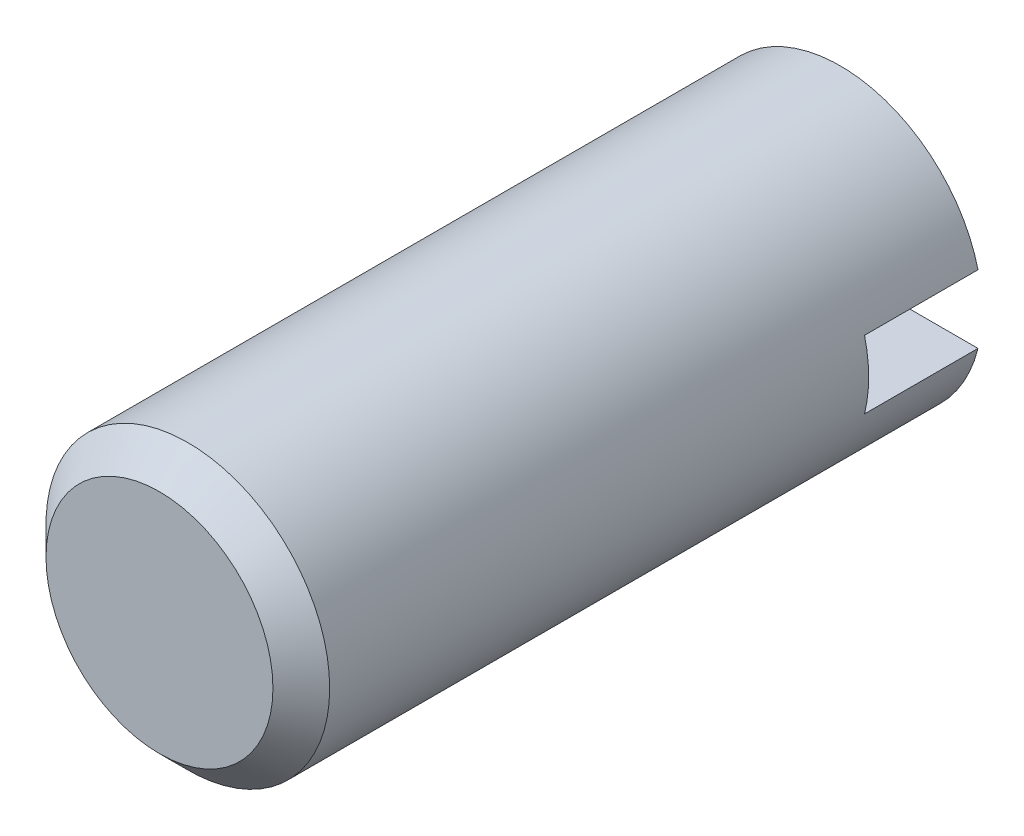
ISO-10303-21;
HEADER;
FILE_DESCRIPTION(('STEP AP214'),'2;1');
FILE_NAME('part.step','',(''),(''),'','','');
FILE_SCHEMA(('AUTOMOTIVE_DESIGN { 1 0 10303 214 1 1 1 1 }'));
ENDSEC;
DATA;
#1=APPLICATION_CONTEXT('core data for automotive mechanical design processes');
#2=APPLICATION_PROTOCOL_DEFINITION('international standard','automotive_design',2000,#1);
#3=PRODUCT_CONTEXT('',#1,'mechanical');
#4=PRODUCT('Part','Part','',(#3));
#5=PRODUCT_RELATED_PRODUCT_CATEGORY('part','',(#4));
#6=PRODUCT_DEFINITION_FORMATION('','',#4);
#7=PRODUCT_DEFINITION_CONTEXT('part definition',#1,'design');
#8=PRODUCT_DEFINITION('design','',#6,#7);
#9=PRODUCT_DEFINITION_SHAPE('','',#8);
#10=(LENGTH_UNIT() NAMED_UNIT(*) SI_UNIT(.MILLI.,.METRE.));
#11=(NAMED_UNIT(*) PLANE_ANGLE_UNIT() SI_UNIT($,.RADIAN.));
#12=(NAMED_UNIT(*) SI_UNIT($,.STERADIAN.) SOLID_ANGLE_UNIT());
#13=UNCERTAINTY_MEASURE_WITH_UNIT(LENGTH_MEASURE(1.E-05),#10,'distance_accuracy_value','');
#14=(GEOMETRIC_REPRESENTATION_CONTEXT(3) GLOBAL_UNCERTAINTY_ASSIGNED_CONTEXT((#13)) GLOBAL_UNIT_ASSIGNED_CONTEXT((#10,
#11,#12)) REPRESENTATION_CONTEXT('',''));
#15=CARTESIAN_POINT('',(0.,0.,0.));
#16=DIRECTION('',(0.,0.,1.));
#17=DIRECTION('',(1.,0.,0.));
#18=AXIS2_PLACEMENT_3D('',#15,#16,#17);
#19=CARTESIAN_POINT('',(0.,2.5,-12.));
#20=DIRECTION('',(0.,0.,1.));
#21=DIRECTION('',(1.,0.,0.));
#22=AXIS2_PLACEMENT_3D('',#19,#20,#21);
#23=PLANE('',#22);
#24=CARTESIAN_POINT('',(0.,0.,-12.));
#25=DIRECTION('',(0.,0.,1.));
#26=DIRECTION('',(1.,0.,0.));
#27=AXIS2_PLACEMENT_3D('',#24,#25,#26);
#28=CIRCLE('',#27,2.5);
#29=CARTESIAN_POINT('',(2.42693221990231,0.6,-12.));
#30=VERTEX_POINT('',#29);
#31=CARTESIAN_POINT('',(-2.42693221990231,0.6,-12.));
#32=VERTEX_POINT('',#31);
#33=EDGE_CURVE('E103',#30,#32,#28,.T.);
#34=ORIENTED_EDGE('',*,*,#33,.F.);
#35=DIRECTION('',(-1.,0.,0.));
#36=VECTOR('',#35,1.);
#37=CARTESIAN_POINT('',(0.,0.6,-12.));
#38=LINE('',#37,#36);
#39=EDGE_CURVE('E90',#30,#32,#38,.T.);
#40=ORIENTED_EDGE('',*,*,#39,.T.);
#41=EDGE_LOOP('',(#34,#40));
#42=FACE_BOUND('',#41,.T.);
#43=ADVANCED_FACE('F43',(#42),#23,.F.);
#44=CARTESIAN_POINT('',(0.,0.,0.));
#45=DIRECTION('',(0.,0.,-1.));
#46=DIRECTION('',(-1.,0.,0.));
#47=AXIS2_PLACEMENT_3D('',#44,#45,#46);
#48=PLANE('',#47);
#49=CARTESIAN_POINT('',(0.,0.,0.));
#50=DIRECTION('',(0.,0.,1.));
#51=DIRECTION('',(1.,0.,0.));
#52=AXIS2_PLACEMENT_3D('',#49,#50,#51);
#53=CIRCLE('',#52,2.);
#54=CARTESIAN_POINT('',(2.,0.,0.));
#55=VERTEX_POINT('',#54);
#56=EDGE_CURVE('E91',#55,#55,#53,.T.);
#57=ORIENTED_EDGE('',*,*,#56,.T.);
#58=EDGE_LOOP('',(#57));
#59=FACE_BOUND('',#58,.T.);
#60=ADVANCED_FACE('F45',(#59),#48,.F.);
#61=CARTESIAN_POINT('',(0.,0.,-0.5));
#62=DIRECTION('',(0.,0.,-1.));
#63=DIRECTION('',(-1.,0.,0.));
#64=AXIS2_PLACEMENT_3D('',#61,#62,#63);
#65=CONICAL_SURFACE('',#64,2.5,0.78539816339745);
#66=ORIENTED_EDGE('',*,*,#56,.F.);
#67=EDGE_LOOP('',(#66));
#68=FACE_BOUND('',#67,.T.);
#69=CARTESIAN_POINT('',(0.,0.,-0.5));
#70=DIRECTION('',(0.,0.,1.));
#71=DIRECTION('',(1.,0.,0.));
#72=AXIS2_PLACEMENT_3D('',#69,#70,#71);
#73=CIRCLE('',#72,2.5);
#74=CARTESIAN_POINT('',(2.5,0.,-0.5));
#75=VERTEX_POINT('',#74);
#76=EDGE_CURVE('E107',#75,#75,#73,.T.);
#77=ORIENTED_EDGE('',*,*,#76,.T.);
#78=EDGE_LOOP('',(#77));
#79=FACE_BOUND('',#78,.T.);
#80=ADVANCED_FACE('F127',(#68,#79),#65,.T.);
#81=CARTESIAN_POINT('',(0.,0.,0.));
#82=DIRECTION('',(0.,0.,1.));
#83=DIRECTION('',(1.,0.,0.));
#84=AXIS2_PLACEMENT_3D('',#81,#82,#83);
#85=CYLINDRICAL_SURFACE('',#84,2.5);
#86=CARTESIAN_POINT('',(0.,0.,-9.99999999999998));
#87=DIRECTION('',(0.,0.,-1.));
#88=DIRECTION('',(-1.,0.,0.));
#89=AXIS2_PLACEMENT_3D('',#86,#87,#88);
#90=CIRCLE('',#89,2.5);
#91=CARTESIAN_POINT('',(2.42693221990231,0.6,-9.99999999999998));
#92=VERTEX_POINT('',#91);
#93=CARTESIAN_POINT('',(2.42693221990231,-0.6,-9.99999999999998));
#94=VERTEX_POINT('',#93);
#95=EDGE_CURVE('E11',#92,#94,#90,.T.);
#96=ORIENTED_EDGE('',*,*,#95,.F.);
#97=DIRECTION('',(0.,0.,1.));
#98=VECTOR('',#97,1.);
#99=CARTESIAN_POINT('',(2.42693221990231,0.6,0.));
#100=LINE('',#99,#98);
#101=EDGE_CURVE('E66',#92,#30,#100,.F.);
#102=ORIENTED_EDGE('',*,*,#101,.T.);
#103=ORIENTED_EDGE('',*,*,#33,.T.);
#104=DIRECTION('',(0.,0.,1.));
#105=VECTOR('',#104,1.);
#106=CARTESIAN_POINT('',(-2.42693221990231,0.6,0.));
#107=LINE('',#106,#105);
#108=CARTESIAN_POINT('',(-2.42693221990231,0.6,-9.99999999999998));
#109=VERTEX_POINT('',#108);
#110=EDGE_CURVE('E104',#32,#109,#107,.T.);
#111=ORIENTED_EDGE('',*,*,#110,.T.);
#112=CARTESIAN_POINT('',(-2.42693221990231,-0.6,-9.99999999999998));
#113=VERTEX_POINT('',#112);
#114=EDGE_CURVE('E47',#113,#109,#90,.T.);
#115=ORIENTED_EDGE('',*,*,#114,.F.);
#116=DIRECTION('',(0.,0.,1.));
#117=VECTOR('',#116,1.);
#118=CARTESIAN_POINT('',(-2.42693221990231,-0.6,0.));
#119=LINE('',#118,#117);
#120=CARTESIAN_POINT('',(-2.42693221990231,-0.6,-12.));
#121=VERTEX_POINT('',#120);
#122=EDGE_CURVE('E85',#113,#121,#119,.F.);
#123=ORIENTED_EDGE('',*,*,#122,.T.);
#124=CARTESIAN_POINT('',(2.42693221990231,-0.6,-12.));
#125=VERTEX_POINT('',#124);
#126=EDGE_CURVE('E98',#121,#125,#28,.T.);
#127=ORIENTED_EDGE('',*,*,#126,.T.);
#128=DIRECTION('',(0.,0.,1.));
#129=VECTOR('',#128,1.);
#130=CARTESIAN_POINT('',(2.42693221990231,-0.6,0.));
#131=LINE('',#130,#129);
#132=EDGE_CURVE('E58',#125,#94,#131,.T.);
#133=ORIENTED_EDGE('',*,*,#132,.T.);
#134=EDGE_LOOP('',(#96,#102,#103,#111,#115,#123,#127,#133));
#135=FACE_BOUND('',#134,.T.);
#136=ORIENTED_EDGE('',*,*,#76,.F.);
#137=EDGE_LOOP('',(#136));
#138=FACE_BOUND('',#137,.T.);
#139=ADVANCED_FACE('F96',(#135,#138),#85,.T.);
#140=ORIENTED_EDGE('',*,*,#126,.F.);
#141=DIRECTION('',(1.,0.,0.));
#142=VECTOR('',#141,1.);
#143=CARTESIAN_POINT('',(0.,-0.6,-12.));
#144=LINE('',#143,#142);
#145=EDGE_CURVE('E82',#121,#125,#144,.T.);
#146=ORIENTED_EDGE('',*,*,#145,.T.);
#147=EDGE_LOOP('',(#140,#146));
#148=FACE_BOUND('',#147,.T.);
#149=ADVANCED_FACE('F102',(#148),#23,.F.);
#150=CARTESIAN_POINT('',(2.71240317337382,-0.6,-9.99999999999998));
#151=DIRECTION('',(0.,0.,-1.));
#152=DIRECTION('',(-1.,0.,0.));
#153=AXIS2_PLACEMENT_3D('',#150,#151,#152);
#154=PLANE('',#153);
#155=ORIENTED_EDGE('',*,*,#95,.T.);
#156=DIRECTION('',(-1.,0.,0.));
#157=VECTOR('',#156,1.);
#158=CARTESIAN_POINT('',(2.71240317337382,-0.6,-9.99999999999998));
#159=LINE('',#158,#157);
#160=EDGE_CURVE('E119',#94,#113,#159,.T.);
#161=ORIENTED_EDGE('',*,*,#160,.T.);
#162=ORIENTED_EDGE('',*,*,#114,.T.);
#163=DIRECTION('',(1.,0.,0.));
#164=VECTOR('',#163,1.);
#165=CARTESIAN_POINT('',(2.71240317337382,0.6,-9.99999999999998));
#166=LINE('',#165,#164);
#167=EDGE_CURVE('E100',#109,#92,#166,.T.);
#168=ORIENTED_EDGE('',*,*,#167,.T.);
#169=EDGE_LOOP('',(#155,#161,#162,#168));
#170=FACE_BOUND('',#169,.T.);
#171=ADVANCED_FACE('F118',(#170),#154,.T.);
#172=CARTESIAN_POINT('',(2.71240317337382,0.6,-9.99999999999998));
#173=DIRECTION('',(0.,1.,0.));
#174=DIRECTION('',(0.,0.,1.));
#175=AXIS2_PLACEMENT_3D('',#172,#173,#174);
#176=PLANE('',#175);
#177=ORIENTED_EDGE('',*,*,#39,.F.);
#178=ORIENTED_EDGE('',*,*,#101,.F.);
#179=ORIENTED_EDGE('',*,*,#167,.F.);
#180=ORIENTED_EDGE('',*,*,#110,.F.);
#181=EDGE_LOOP('',(#177,#178,#179,#180));
#182=FACE_BOUND('',#181,.T.);
#183=ADVANCED_FACE('F120',(#182),#176,.F.);
#184=CARTESIAN_POINT('',(2.71240317337382,-0.6,-9.99999999999998));
#185=DIRECTION('',(0.,-1.,0.));
#186=DIRECTION('',(0.,0.,-1.));
#187=AXIS2_PLACEMENT_3D('',#184,#185,#186);
#188=PLANE('',#187);
#189=ORIENTED_EDGE('',*,*,#145,.F.);
#190=ORIENTED_EDGE('',*,*,#122,.F.);
#191=ORIENTED_EDGE('',*,*,#160,.F.);
#192=ORIENTED_EDGE('',*,*,#132,.F.);
#193=EDGE_LOOP('',(#189,#190,#191,#192));
#194=FACE_BOUND('',#193,.T.);
#195=ADVANCED_FACE('F84',(#194),#188,.F.);
#196=CLOSED_SHELL('',(#43,#60,#80,#139,#149,#171,#183,#195));
#197=MANIFOLD_SOLID_BREP('B2',#196);
#198=ADVANCED_BREP_SHAPE_REPRESENTATION('',(#18,#197),#14);
#199=SHAPE_DEFINITION_REPRESENTATION(#9,#198);
ENDSEC;
END-ISO-10303-21;
